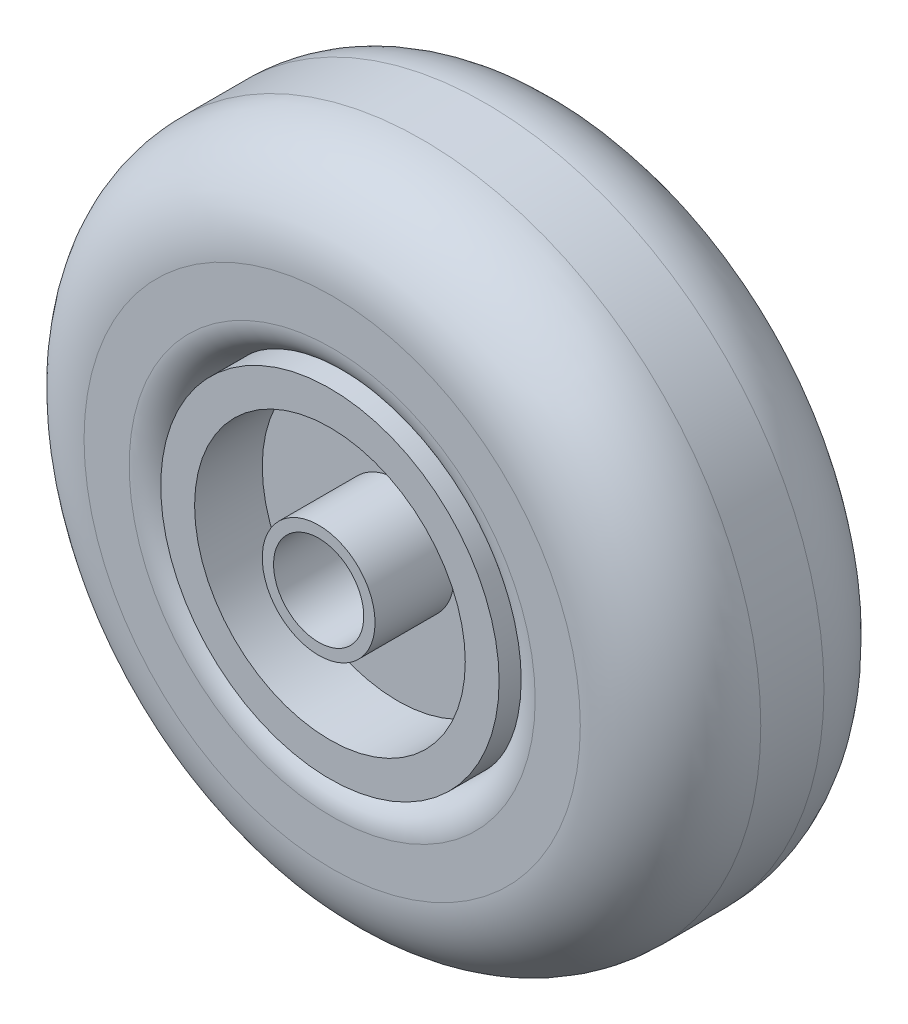
ISO-10303-21;
HEADER;
FILE_DESCRIPTION(('STEP AP214'),'2;1');
FILE_NAME('part.step','',(''),(''),'','','');
FILE_SCHEMA(('AUTOMOTIVE_DESIGN { 1 0 10303 214 1 1 1 1 }'));
ENDSEC;
DATA;
#1=APPLICATION_CONTEXT('core data for automotive mechanical design processes');
#2=APPLICATION_PROTOCOL_DEFINITION('international standard','automotive_design',2000,#1);
#3=PRODUCT_CONTEXT('',#1,'mechanical');
#4=PRODUCT('Part','Part','',(#3));
#5=PRODUCT_RELATED_PRODUCT_CATEGORY('part','',(#4));
#6=PRODUCT_DEFINITION_FORMATION('','',#4);
#7=PRODUCT_DEFINITION_CONTEXT('part definition',#1,'design');
#8=PRODUCT_DEFINITION('design','',#6,#7);
#9=PRODUCT_DEFINITION_SHAPE('','',#8);
#10=(LENGTH_UNIT() NAMED_UNIT(*) SI_UNIT(.MILLI.,.METRE.));
#11=(NAMED_UNIT(*) PLANE_ANGLE_UNIT() SI_UNIT($,.RADIAN.));
#12=(NAMED_UNIT(*) SI_UNIT($,.STERADIAN.) SOLID_ANGLE_UNIT());
#13=UNCERTAINTY_MEASURE_WITH_UNIT(LENGTH_MEASURE(1.E-05),#10,'distance_accuracy_value','');
#14=(GEOMETRIC_REPRESENTATION_CONTEXT(3) GLOBAL_UNCERTAINTY_ASSIGNED_CONTEXT((#13)) GLOBAL_UNIT_ASSIGNED_CONTEXT((#10,
#11,#12)) REPRESENTATION_CONTEXT('',''));
#15=CARTESIAN_POINT('',(0.,0.,0.));
#16=DIRECTION('',(0.,0.,1.));
#17=DIRECTION('',(1.,0.,0.));
#18=AXIS2_PLACEMENT_3D('',#15,#16,#17);
#19=CARTESIAN_POINT('',(0.,0.,17.4625));
#20=DIRECTION('',(0.,0.,1.));
#21=DIRECTION('',(1.,0.,0.));
#22=AXIS2_PLACEMENT_3D('',#19,#20,#21);
#23=PLANE('',#22);
#24=CARTESIAN_POINT('',(0.,0.,17.4625));
#25=DIRECTION('',(0.,0.,1.));
#26=DIRECTION('',(1.,0.,0.));
#27=AXIS2_PLACEMENT_3D('',#24,#25,#26);
#28=CIRCLE('',#27,23.8125);
#29=CARTESIAN_POINT('',(23.8125,0.,17.4625));
#30=VERTEX_POINT('',#29);
#31=EDGE_CURVE('E11',#30,#30,#28,.T.);
#32=ORIENTED_EDGE('',*,*,#31,.T.);
#33=EDGE_LOOP('',(#32));
#34=FACE_BOUND('',#33,.T.);
#35=CARTESIAN_POINT('',(0.,0.,17.4625));
#36=DIRECTION('',(0.,0.,-1.));
#37=DIRECTION('',(-1.,0.,0.));
#38=AXIS2_PLACEMENT_3D('',#35,#36,#37);
#39=CIRCLE('',#38,19.05);
#40=CARTESIAN_POINT('',(19.05,0.,17.4625));
#41=VERTEX_POINT('',#40);
#42=EDGE_CURVE('E70',#41,#41,#39,.T.);
#43=ORIENTED_EDGE('',*,*,#42,.T.);
#44=EDGE_LOOP('',(#43));
#45=FACE_BOUND('',#44,.T.);
#46=ADVANCED_FACE('F46',(#34,#45),#23,.T.);
#47=CARTESIAN_POINT('',(0.,0.,-17.4625));
#48=DIRECTION('',(0.,0.,1.));
#49=DIRECTION('',(1.,0.,0.));
#50=AXIS2_PLACEMENT_3D('',#47,#48,#49);
#51=PLANE('',#50);
#52=CARTESIAN_POINT('',(0.,0.,-17.4625));
#53=DIRECTION('',(0.,0.,-1.));
#54=DIRECTION('',(-1.,0.,0.));
#55=AXIS2_PLACEMENT_3D('',#52,#53,#54);
#56=CIRCLE('',#55,19.05);
#57=CARTESIAN_POINT('',(-19.05,0.,-17.4625));
#58=VERTEX_POINT('',#57);
#59=EDGE_CURVE('E61',#58,#58,#56,.T.);
#60=ORIENTED_EDGE('',*,*,#59,.F.);
#61=EDGE_LOOP('',(#60));
#62=FACE_BOUND('',#61,.T.);
#63=CARTESIAN_POINT('',(0.,0.,-17.4625));
#64=DIRECTION('',(0.,0.,1.));
#65=DIRECTION('',(1.,0.,0.));
#66=AXIS2_PLACEMENT_3D('',#63,#64,#65);
#67=CIRCLE('',#66,23.8125);
#68=CARTESIAN_POINT('',(23.8125,0.,-17.4625));
#69=VERTEX_POINT('',#68);
#70=EDGE_CURVE('E53',#69,#69,#67,.T.);
#71=ORIENTED_EDGE('',*,*,#70,.F.);
#72=EDGE_LOOP('',(#71));
#73=FACE_BOUND('',#72,.T.);
#74=ADVANCED_FACE('F48',(#62,#73),#51,.F.);
#75=CARTESIAN_POINT('',(0.,0.,0.));
#76=DIRECTION('',(0.,0.,1.));
#77=DIRECTION('',(1.,0.,0.));
#78=AXIS2_PLACEMENT_3D('',#75,#76,#77);
#79=CYLINDRICAL_SURFACE('',#78,23.8125);
#80=ORIENTED_EDGE('',*,*,#70,.T.);
#81=EDGE_LOOP('',(#80));
#82=FACE_BOUND('',#81,.T.);
#83=ORIENTED_EDGE('',*,*,#31,.F.);
#84=EDGE_LOOP('',(#83));
#85=FACE_BOUND('',#84,.T.);
#86=ADVANCED_FACE('F121',(#82,#85),#79,.T.);
#87=CARTESIAN_POINT('',(0.,0.,-7.9375));
#88=DIRECTION('',(0.,0.,-1.));
#89=DIRECTION('',(-1.,0.,0.));
#90=AXIS2_PLACEMENT_3D('',#87,#88,#89);
#91=CYLINDRICAL_SURFACE('',#90,19.05);
#92=CARTESIAN_POINT('',(0.,0.,-7.9375));
#93=DIRECTION('',(0.,0.,-1.));
#94=DIRECTION('',(-1.,0.,0.));
#95=AXIS2_PLACEMENT_3D('',#92,#93,#94);
#96=CIRCLE('',#95,19.05);
#97=CARTESIAN_POINT('',(-19.05,0.,-7.9375));
#98=VERTEX_POINT('',#97);
#99=EDGE_CURVE('E57',#98,#98,#96,.T.);
#100=CARTESIAN_POINT('',(-19.05,0.,-7.9375));
#101=CARTESIAN_POINT('',(-19.05,0.,-8.03671875));
#102=CARTESIAN_POINT('',(-19.05,0.,-8.1359375));
#103=CARTESIAN_POINT('',(-19.05,0.,-8.334375));
#104=CARTESIAN_POINT('',(-19.05,0.,-8.43359375));
#105=CARTESIAN_POINT('',(-19.05,0.,-8.63203125));
#106=CARTESIAN_POINT('',(-19.05,0.,-8.73125));
#107=CARTESIAN_POINT('',(-19.05,0.,-8.9296875));
#108=CARTESIAN_POINT('',(-19.05,0.,-9.02890625));
#109=CARTESIAN_POINT('',(-19.05,0.,-9.22734375));
#110=CARTESIAN_POINT('',(-19.05,0.,-9.3265625));
#111=CARTESIAN_POINT('',(-19.05,0.,-9.525));
#112=CARTESIAN_POINT('',(-19.05,0.,-9.62421875));
#113=CARTESIAN_POINT('',(-19.05,0.,-9.82265625));
#114=CARTESIAN_POINT('',(-19.05,0.,-9.921875));
#115=CARTESIAN_POINT('',(-19.05,0.,-10.1203125));
#116=CARTESIAN_POINT('',(-19.05,0.,-10.21953125));
#117=CARTESIAN_POINT('',(-19.05,0.,-10.41796875));
#118=CARTESIAN_POINT('',(-19.05,0.,-10.5171875));
#119=CARTESIAN_POINT('',(-19.05,0.,-10.715625));
#120=CARTESIAN_POINT('',(-19.05,0.,-10.81484375));
#121=CARTESIAN_POINT('',(-19.05,0.,-11.01328125));
#122=CARTESIAN_POINT('',(-19.05,0.,-11.1125));
#123=CARTESIAN_POINT('',(-19.05,0.,-11.3109375));
#124=CARTESIAN_POINT('',(-19.05,0.,-11.41015625));
#125=CARTESIAN_POINT('',(-19.05,0.,-11.60859375));
#126=CARTESIAN_POINT('',(-19.05,0.,-11.7078125));
#127=CARTESIAN_POINT('',(-19.05,0.,-11.90625));
#128=CARTESIAN_POINT('',(-19.05,0.,-12.00546875));
#129=CARTESIAN_POINT('',(-19.05,0.,-12.20390625));
#130=CARTESIAN_POINT('',(-19.05,0.,-12.303125));
#131=CARTESIAN_POINT('',(-19.05,0.,-12.5015625));
#132=CARTESIAN_POINT('',(-19.05,0.,-12.60078125));
#133=CARTESIAN_POINT('',(-19.05,0.,-12.79921875));
#134=CARTESIAN_POINT('',(-19.05,0.,-12.8984375));
#135=CARTESIAN_POINT('',(-19.05,0.,-13.096875));
#136=CARTESIAN_POINT('',(-19.05,0.,-13.19609375));
#137=CARTESIAN_POINT('',(-19.05,0.,-13.39453125));
#138=CARTESIAN_POINT('',(-19.05,0.,-13.49375));
#139=CARTESIAN_POINT('',(-19.05,0.,-13.6921875));
#140=CARTESIAN_POINT('',(-19.05,0.,-13.79140625));
#141=CARTESIAN_POINT('',(-19.05,0.,-13.98984375));
#142=CARTESIAN_POINT('',(-19.05,0.,-14.0890625));
#143=CARTESIAN_POINT('',(-19.05,0.,-14.2875));
#144=CARTESIAN_POINT('',(-19.05,0.,-14.38671875));
#145=CARTESIAN_POINT('',(-19.05,0.,-14.58515625));
#146=CARTESIAN_POINT('',(-19.05,0.,-14.684375));
#147=CARTESIAN_POINT('',(-19.05,0.,-14.8828125));
#148=CARTESIAN_POINT('',(-19.05,0.,-14.98203125));
#149=CARTESIAN_POINT('',(-19.05,0.,-15.18046875));
#150=CARTESIAN_POINT('',(-19.05,0.,-15.2796875));
#151=CARTESIAN_POINT('',(-19.05,0.,-15.478125));
#152=CARTESIAN_POINT('',(-19.05,0.,-15.57734375));
#153=CARTESIAN_POINT('',(-19.05,0.,-15.77578125));
#154=CARTESIAN_POINT('',(-19.05,0.,-15.875));
#155=CARTESIAN_POINT('',(-19.05,0.,-16.0734375));
#156=CARTESIAN_POINT('',(-19.05,0.,-16.17265625));
#157=CARTESIAN_POINT('',(-19.05,0.,-16.37109375));
#158=CARTESIAN_POINT('',(-19.05,0.,-16.4703125));
#159=CARTESIAN_POINT('',(-19.05,0.,-16.66875));
#160=CARTESIAN_POINT('',(-19.05,0.,-16.76796875));
#161=CARTESIAN_POINT('',(-19.05,0.,-16.96640625));
#162=CARTESIAN_POINT('',(-19.05,0.,-17.065625));
#163=CARTESIAN_POINT('',(-19.05,0.,-17.2640625));
#164=CARTESIAN_POINT('',(-19.05,0.,-17.36328125));
#165=CARTESIAN_POINT('',(-19.05,0.,-17.4625));
#166=B_SPLINE_CURVE_WITH_KNOTS('',3,(#100,#101,#102,#103,#104,#105,#106,#107,#108,#109,#110,
#111,#112,#113,#114,#115,#116,#117,#118,#119,#120,#121,#122,#123,#124,#125,#126,#127,#128,#129,
#130,#131,#132,#133,#134,#135,#136,#137,#138,#139,#140,#141,#142,#143,#144,#145,#146,#147,#148,
#149,#150,#151,#152,#153,#154,#155,#156,#157,#158,#159,#160,#161,#162,#163,#164,#165),
.UNSPECIFIED.,.F.,.F.,(4,2,2,2,2,2,2,2,2,2,2,2,2,2,2,2,2,2,2,2,2,2,2,2,2,2,2,2,2,2,2,2,4),(0.,
0.29765625,0.5953125,0.892968750000001,1.190625,1.48828125,1.7859375,2.08359375,2.38125,
2.67890625,2.9765625,3.27421875,3.571875,3.86953125,4.1671875,4.46484375,4.7625,5.06015625,
5.3578125,5.65546875,5.953125,6.25078125,6.5484375,6.84609375,7.14375,7.44140625,7.7390625,
8.03671875,8.334375,8.63203125,8.9296875,9.22734375,9.525),.UNSPECIFIED.);
#167=EDGE_CURVE('BSEAM113',#98,#58,#166,.T.);
#168=ORIENTED_EDGE('',*,*,#99,.F.);
#169=ORIENTED_EDGE('',*,*,#59,.T.);
#170=ORIENTED_EDGE('',*,*,#167,.T.);
#171=ORIENTED_EDGE('',*,*,#167,.F.);
#172=EDGE_LOOP('',(#168,#170,#169,#171));
#173=FACE_BOUND('',#172,.T.);
#174=ADVANCED_FACE('F113',(#173),#91,.F.);
#175=CARTESIAN_POINT('',(0.,0.,-7.9375));
#176=DIRECTION('',(0.,0.,-1.));
#177=DIRECTION('',(-1.,0.,0.));
#178=AXIS2_PLACEMENT_3D('',#175,#176,#177);
#179=PLANE('',#178);
#180=CARTESIAN_POINT('',(0.,0.,-7.9375));
#181=DIRECTION('',(0.,0.,-1.));
#182=DIRECTION('',(-1.,0.,0.));
#183=AXIS2_PLACEMENT_3D('',#180,#181,#182);
#184=CIRCLE('',#183,7.9375);
#185=CARTESIAN_POINT('',(-7.9375,0.,-7.9375));
#186=VERTEX_POINT('',#185);
#187=EDGE_CURVE('E65',#186,#186,#184,.T.);
#188=ORIENTED_EDGE('',*,*,#187,.F.);
#189=EDGE_LOOP('',(#188));
#190=FACE_BOUND('',#189,.T.);
#191=ORIENTED_EDGE('',*,*,#99,.T.);
#192=EDGE_LOOP('',(#191));
#193=FACE_BOUND('',#192,.T.);
#194=ADVANCED_FACE('F103',(#190,#193),#179,.T.);
#195=CARTESIAN_POINT('',(0.,0.,-7.9375));
#196=DIRECTION('',(0.,0.,-1.));
#197=DIRECTION('',(-1.,0.,0.));
#198=AXIS2_PLACEMENT_3D('',#195,#196,#197);
#199=CYLINDRICAL_SURFACE('',#198,7.9375);
#200=CARTESIAN_POINT('',(0.,0.,-19.05));
#201=DIRECTION('',(0.,0.,1.));
#202=DIRECTION('',(1.,0.,0.));
#203=AXIS2_PLACEMENT_3D('',#200,#201,#202);
#204=CIRCLE('',#203,7.9375);
#205=CARTESIAN_POINT('',(-7.9375,0.,-19.05));
#206=VERTEX_POINT('',#205);
#207=EDGE_CURVE('E79',#206,#206,#204,.T.);
#208=CARTESIAN_POINT('',(-7.9375,0.,-7.9375));
#209=CARTESIAN_POINT('',(-7.9375,0.,-8.05325520833333));
#210=CARTESIAN_POINT('',(-7.9375,0.,-8.16901041666666));
#211=CARTESIAN_POINT('',(-7.9375,0.,-8.40052083333333));
#212=CARTESIAN_POINT('',(-7.9375,0.,-8.51627604166666));
#213=CARTESIAN_POINT('',(-7.9375,0.,-8.74778645833333));
#214=CARTESIAN_POINT('',(-7.9375,0.,-8.86354166666666));
#215=CARTESIAN_POINT('',(-7.9375,0.,-9.09505208333333));
#216=CARTESIAN_POINT('',(-7.9375,0.,-9.21080729166667));
#217=CARTESIAN_POINT('',(-7.9375,0.,-9.44231770833333));
#218=CARTESIAN_POINT('',(-7.9375,0.,-9.55807291666667));
#219=CARTESIAN_POINT('',(-7.9375,0.,-9.78958333333333));
#220=CARTESIAN_POINT('',(-7.9375,0.,-9.90533854166666));
#221=CARTESIAN_POINT('',(-7.9375,0.,-10.1368489583333));
#222=CARTESIAN_POINT('',(-7.9375,0.,-10.2526041666667));
#223=CARTESIAN_POINT('',(-7.9375,0.,-10.4841145833333));
#224=CARTESIAN_POINT('',(-7.9375,0.,-10.5998697916667));
#225=CARTESIAN_POINT('',(-7.9375,0.,-10.8313802083333));
#226=CARTESIAN_POINT('',(-7.9375,0.,-10.9471354166667));
#227=CARTESIAN_POINT('',(-7.9375,0.,-11.1786458333333));
#228=CARTESIAN_POINT('',(-7.9375,0.,-11.2944010416667));
#229=CARTESIAN_POINT('',(-7.9375,0.,-11.5259114583333));
#230=CARTESIAN_POINT('',(-7.9375,0.,-11.6416666666667));
#231=CARTESIAN_POINT('',(-7.9375,0.,-11.8731770833333));
#232=CARTESIAN_POINT('',(-7.9375,0.,-11.9889322916667));
#233=CARTESIAN_POINT('',(-7.9375,0.,-12.2204427083333));
#234=CARTESIAN_POINT('',(-7.9375,0.,-12.3361979166667));
#235=CARTESIAN_POINT('',(-7.9375,0.,-12.5677083333333));
#236=CARTESIAN_POINT('',(-7.9375,0.,-12.6834635416667));
#237=CARTESIAN_POINT('',(-7.9375,0.,-12.9149739583333));
#238=CARTESIAN_POINT('',(-7.9375,0.,-13.0307291666667));
#239=CARTESIAN_POINT('',(-7.9375,0.,-13.2622395833333));
#240=CARTESIAN_POINT('',(-7.9375,0.,-13.3779947916667));
#241=CARTESIAN_POINT('',(-7.9375,0.,-13.6095052083333));
#242=CARTESIAN_POINT('',(-7.9375,0.,-13.7252604166667));
#243=CARTESIAN_POINT('',(-7.9375,0.,-13.9567708333333));
#244=CARTESIAN_POINT('',(-7.9375,0.,-14.0725260416667));
#245=CARTESIAN_POINT('',(-7.9375,0.,-14.3040364583333));
#246=CARTESIAN_POINT('',(-7.9375,0.,-14.4197916666667));
#247=CARTESIAN_POINT('',(-7.9375,0.,-14.6513020833333));
#248=CARTESIAN_POINT('',(-7.9375,0.,-14.7670572916667));
#249=CARTESIAN_POINT('',(-7.9375,0.,-14.9985677083333));
#250=CARTESIAN_POINT('',(-7.9375,0.,-15.1143229166667));
#251=CARTESIAN_POINT('',(-7.9375,0.,-15.3458333333333));
#252=CARTESIAN_POINT('',(-7.9375,0.,-15.4615885416667));
#253=CARTESIAN_POINT('',(-7.9375,0.,-15.6930989583333));
#254=CARTESIAN_POINT('',(-7.9375,0.,-15.8088541666667));
#255=CARTESIAN_POINT('',(-7.9375,0.,-16.0403645833333));
#256=CARTESIAN_POINT('',(-7.9375,0.,-16.1561197916667));
#257=CARTESIAN_POINT('',(-7.9375,0.,-16.3876302083333));
#258=CARTESIAN_POINT('',(-7.9375,0.,-16.5033854166667));
#259=CARTESIAN_POINT('',(-7.9375,0.,-16.7348958333333));
#260=CARTESIAN_POINT('',(-7.9375,0.,-16.8506510416667));
#261=CARTESIAN_POINT('',(-7.9375,0.,-17.0821614583333));
#262=CARTESIAN_POINT('',(-7.9375,0.,-17.1979166666667));
#263=CARTESIAN_POINT('',(-7.9375,0.,-17.4294270833333));
#264=CARTESIAN_POINT('',(-7.9375,0.,-17.5451822916667));
#265=CARTESIAN_POINT('',(-7.9375,0.,-17.7766927083333));
#266=CARTESIAN_POINT('',(-7.9375,0.,-17.8924479166667));
#267=CARTESIAN_POINT('',(-7.9375,0.,-18.1239583333333));
#268=CARTESIAN_POINT('',(-7.9375,0.,-18.2397135416667));
#269=CARTESIAN_POINT('',(-7.9375,0.,-18.4712239583333));
#270=CARTESIAN_POINT('',(-7.9375,0.,-18.5869791666667));
#271=CARTESIAN_POINT('',(-7.9375,0.,-18.8184895833333));
#272=CARTESIAN_POINT('',(-7.9375,0.,-18.9342447916667));
#273=CARTESIAN_POINT('',(-7.9375,0.,-19.05));
#274=B_SPLINE_CURVE_WITH_KNOTS('',3,(#208,#209,#210,#211,#212,#213,#214,#215,#216,#217,#218,
#219,#220,#221,#222,#223,#224,#225,#226,#227,#228,#229,#230,#231,#232,#233,#234,#235,#236,#237,
#238,#239,#240,#241,#242,#243,#244,#245,#246,#247,#248,#249,#250,#251,#252,#253,#254,#255,#256,
#257,#258,#259,#260,#261,#262,#263,#264,#265,#266,#267,#268,#269,#270,#271,#272,#273),
.UNSPECIFIED.,.F.,.F.,(4,2,2,2,2,2,2,2,2,2,2,2,2,2,2,2,2,2,2,2,2,2,2,2,2,2,2,2,2,2,2,2,4),(0.,
0.347265625000001,0.694531250000002,1.041796875,1.3890625,1.736328125,2.08359375,2.430859375,
2.778125,3.125390625,3.47265625,3.819921875,4.1671875,4.514453125,4.86171875,5.208984375,
5.55625,5.903515625,6.25078125,6.598046875,6.9453125,7.292578125,7.63984375,7.987109375,
8.334375,8.681640625,9.02890625,9.376171875,9.7234375,10.070703125,10.41796875,10.765234375,
11.1125),.UNSPECIFIED.);
#275=EDGE_CURVE('BSEAM100',#186,#206,#274,.T.);
#276=ORIENTED_EDGE('',*,*,#187,.T.);
#277=ORIENTED_EDGE('',*,*,#207,.T.);
#278=ORIENTED_EDGE('',*,*,#275,.T.);
#279=ORIENTED_EDGE('',*,*,#275,.F.);
#280=EDGE_LOOP('',(#276,#278,#277,#279));
#281=FACE_BOUND('',#280,.T.);
#282=ADVANCED_FACE('F100',(#281),#199,.T.);
#283=CARTESIAN_POINT('',(0.,0.,7.9375));
#284=DIRECTION('',(0.,0.,1.));
#285=DIRECTION('',(-1.,0.,0.));
#286=AXIS2_PLACEMENT_3D('',#283,#284,#285);
#287=PLANE('',#286);
#288=CARTESIAN_POINT('',(0.,0.,7.9375));
#289=DIRECTION('',(0.,0.,-1.));
#290=DIRECTION('',(-1.,0.,0.));
#291=AXIS2_PLACEMENT_3D('',#288,#289,#290);
#292=CIRCLE('',#291,19.05);
#293=CARTESIAN_POINT('',(19.05,0.,7.9375));
#294=VERTEX_POINT('',#293);
#295=EDGE_CURVE('E69',#294,#294,#292,.T.);
#296=ORIENTED_EDGE('',*,*,#295,.F.);
#297=EDGE_LOOP('',(#296));
#298=FACE_BOUND('',#297,.T.);
#299=CARTESIAN_POINT('',(0.,0.,7.9375));
#300=DIRECTION('',(0.,0.,-1.));
#301=DIRECTION('',(-1.,0.,0.));
#302=AXIS2_PLACEMENT_3D('',#299,#300,#301);
#303=CIRCLE('',#302,7.9375);
#304=CARTESIAN_POINT('',(7.9375,0.,7.9375));
#305=VERTEX_POINT('',#304);
#306=EDGE_CURVE('E73',#305,#305,#303,.T.);
#307=ORIENTED_EDGE('',*,*,#306,.T.);
#308=EDGE_LOOP('',(#307));
#309=FACE_BOUND('',#308,.T.);
#310=ADVANCED_FACE('F102',(#298,#309),#287,.T.);
#311=CARTESIAN_POINT('',(0.,0.,7.9375));
#312=DIRECTION('',(0.,0.,1.));
#313=DIRECTION('',(1.,0.,0.));
#314=AXIS2_PLACEMENT_3D('',#311,#312,#313);
#315=CYLINDRICAL_SURFACE('',#314,19.05);
#316=CARTESIAN_POINT('',(19.05,0.,7.9375));
#317=CARTESIAN_POINT('',(19.05,0.,8.03671875));
#318=CARTESIAN_POINT('',(19.05,0.,8.1359375));
#319=CARTESIAN_POINT('',(19.05,0.,8.334375));
#320=CARTESIAN_POINT('',(19.05,0.,8.43359375));
#321=CARTESIAN_POINT('',(19.05,0.,8.63203125));
#322=CARTESIAN_POINT('',(19.05,0.,8.73125));
#323=CARTESIAN_POINT('',(19.05,0.,8.9296875));
#324=CARTESIAN_POINT('',(19.05,0.,9.02890625));
#325=CARTESIAN_POINT('',(19.05,0.,9.22734375));
#326=CARTESIAN_POINT('',(19.05,0.,9.3265625));
#327=CARTESIAN_POINT('',(19.05,0.,9.525));
#328=CARTESIAN_POINT('',(19.05,0.,9.62421875));
#329=CARTESIAN_POINT('',(19.05,0.,9.82265625));
#330=CARTESIAN_POINT('',(19.05,0.,9.921875));
#331=CARTESIAN_POINT('',(19.05,0.,10.1203125));
#332=CARTESIAN_POINT('',(19.05,0.,10.21953125));
#333=CARTESIAN_POINT('',(19.05,0.,10.41796875));
#334=CARTESIAN_POINT('',(19.05,0.,10.5171875));
#335=CARTESIAN_POINT('',(19.05,0.,10.715625));
#336=CARTESIAN_POINT('',(19.05,0.,10.81484375));
#337=CARTESIAN_POINT('',(19.05,0.,11.01328125));
#338=CARTESIAN_POINT('',(19.05,0.,11.1125));
#339=CARTESIAN_POINT('',(19.05,0.,11.3109375));
#340=CARTESIAN_POINT('',(19.05,0.,11.41015625));
#341=CARTESIAN_POINT('',(19.05,0.,11.60859375));
#342=CARTESIAN_POINT('',(19.05,0.,11.7078125));
#343=CARTESIAN_POINT('',(19.05,0.,11.90625));
#344=CARTESIAN_POINT('',(19.05,0.,12.00546875));
#345=CARTESIAN_POINT('',(19.05,0.,12.20390625));
#346=CARTESIAN_POINT('',(19.05,0.,12.303125));
#347=CARTESIAN_POINT('',(19.05,0.,12.5015625));
#348=CARTESIAN_POINT('',(19.05,0.,12.60078125));
#349=CARTESIAN_POINT('',(19.05,0.,12.79921875));
#350=CARTESIAN_POINT('',(19.05,0.,12.8984375));
#351=CARTESIAN_POINT('',(19.05,0.,13.096875));
#352=CARTESIAN_POINT('',(19.05,0.,13.19609375));
#353=CARTESIAN_POINT('',(19.05,0.,13.39453125));
#354=CARTESIAN_POINT('',(19.05,0.,13.49375));
#355=CARTESIAN_POINT('',(19.05,0.,13.6921875));
#356=CARTESIAN_POINT('',(19.05,0.,13.79140625));
#357=CARTESIAN_POINT('',(19.05,0.,13.98984375));
#358=CARTESIAN_POINT('',(19.05,0.,14.0890625));
#359=CARTESIAN_POINT('',(19.05,0.,14.2875));
#360=CARTESIAN_POINT('',(19.05,0.,14.38671875));
#361=CARTESIAN_POINT('',(19.05,0.,14.58515625));
#362=CARTESIAN_POINT('',(19.05,0.,14.684375));
#363=CARTESIAN_POINT('',(19.05,0.,14.8828125));
#364=CARTESIAN_POINT('',(19.05,0.,14.98203125));
#365=CARTESIAN_POINT('',(19.05,0.,15.18046875));
#366=CARTESIAN_POINT('',(19.05,0.,15.2796875));
#367=CARTESIAN_POINT('',(19.05,0.,15.478125));
#368=CARTESIAN_POINT('',(19.05,0.,15.57734375));
#369=CARTESIAN_POINT('',(19.05,0.,15.77578125));
#370=CARTESIAN_POINT('',(19.05,0.,15.875));
#371=CARTESIAN_POINT('',(19.05,0.,16.0734375));
#372=CARTESIAN_POINT('',(19.05,0.,16.17265625));
#373=CARTESIAN_POINT('',(19.05,0.,16.37109375));
#374=CARTESIAN_POINT('',(19.05,0.,16.4703125));
#375=CARTESIAN_POINT('',(19.05,0.,16.66875));
#376=CARTESIAN_POINT('',(19.05,0.,16.76796875));
#377=CARTESIAN_POINT('',(19.05,0.,16.96640625));
#378=CARTESIAN_POINT('',(19.05,0.,17.065625));
#379=CARTESIAN_POINT('',(19.05,0.,17.2640625));
#380=CARTESIAN_POINT('',(19.05,0.,17.36328125));
#381=CARTESIAN_POINT('',(19.05,0.,17.4625));
#382=B_SPLINE_CURVE_WITH_KNOTS('',3,(#316,#317,#318,#319,#320,#321,#322,#323,#324,#325,#326,
#327,#328,#329,#330,#331,#332,#333,#334,#335,#336,#337,#338,#339,#340,#341,#342,#343,#344,#345,
#346,#347,#348,#349,#350,#351,#352,#353,#354,#355,#356,#357,#358,#359,#360,#361,#362,#363,#364,
#365,#366,#367,#368,#369,#370,#371,#372,#373,#374,#375,#376,#377,#378,#379,#380,#381),
.UNSPECIFIED.,.F.,.F.,(4,2,2,2,2,2,2,2,2,2,2,2,2,2,2,2,2,2,2,2,2,2,2,2,2,2,2,2,2,2,2,2,4),(0.,
0.29765625,0.5953125,0.892968750000001,1.190625,1.48828125,1.7859375,2.08359375,2.38125,
2.67890625,2.9765625,3.27421875,3.571875,3.86953125,4.1671875,4.46484375,4.7625,5.06015625,
5.3578125,5.65546875,5.953125,6.25078125,6.5484375,6.84609375,7.14375,7.44140625,
7.73906250000001,8.03671875,8.334375,8.63203125,8.9296875,9.22734375,9.525),.UNSPECIFIED.);
#383=EDGE_CURVE('BSEAM110',#294,#41,#382,.T.);
#384=ORIENTED_EDGE('',*,*,#295,.T.);
#385=ORIENTED_EDGE('',*,*,#42,.F.);
#386=ORIENTED_EDGE('',*,*,#383,.T.);
#387=ORIENTED_EDGE('',*,*,#383,.F.);
#388=EDGE_LOOP('',(#384,#386,#385,#387));
#389=FACE_BOUND('',#388,.T.);
#390=ADVANCED_FACE('F110',(#389),#315,.F.);
#391=CARTESIAN_POINT('',(0.,0.,7.9375));
#392=DIRECTION('',(0.,0.,1.));
#393=DIRECTION('',(1.,0.,0.));
#394=AXIS2_PLACEMENT_3D('',#391,#392,#393);
#395=CYLINDRICAL_SURFACE('',#394,7.9375);
#396=CARTESIAN_POINT('',(0.,0.,19.05));
#397=DIRECTION('',(0.,0.,1.));
#398=DIRECTION('',(1.,0.,0.));
#399=AXIS2_PLACEMENT_3D('',#396,#397,#398);
#400=CIRCLE('',#399,7.9375);
#401=CARTESIAN_POINT('',(7.9375,0.,19.05));
#402=VERTEX_POINT('',#401);
#403=EDGE_CURVE('E78',#402,#402,#400,.T.);
#404=CARTESIAN_POINT('',(7.9375,0.,7.9375));
#405=CARTESIAN_POINT('',(7.9375,0.,8.05325520833333));
#406=CARTESIAN_POINT('',(7.9375,0.,8.16901041666667));
#407=CARTESIAN_POINT('',(7.9375,0.,8.40052083333333));
#408=CARTESIAN_POINT('',(7.9375,0.,8.51627604166667));
#409=CARTESIAN_POINT('',(7.9375,0.,8.74778645833333));
#410=CARTESIAN_POINT('',(7.9375,0.,8.86354166666666));
#411=CARTESIAN_POINT('',(7.9375,0.,9.09505208333333));
#412=CARTESIAN_POINT('',(7.9375,0.,9.21080729166667));
#413=CARTESIAN_POINT('',(7.9375,0.,9.44231770833333));
#414=CARTESIAN_POINT('',(7.9375,0.,9.55807291666667));
#415=CARTESIAN_POINT('',(7.9375,0.,9.78958333333333));
#416=CARTESIAN_POINT('',(7.9375,0.,9.90533854166667));
#417=CARTESIAN_POINT('',(7.9375,0.,10.1368489583333));
#418=CARTESIAN_POINT('',(7.9375,0.,10.2526041666667));
#419=CARTESIAN_POINT('',(7.9375,0.,10.4841145833333));
#420=CARTESIAN_POINT('',(7.9375,0.,10.5998697916667));
#421=CARTESIAN_POINT('',(7.9375,0.,10.8313802083333));
#422=CARTESIAN_POINT('',(7.9375,0.,10.9471354166667));
#423=CARTESIAN_POINT('',(7.9375,0.,11.1786458333333));
#424=CARTESIAN_POINT('',(7.9375,0.,11.2944010416667));
#425=CARTESIAN_POINT('',(7.9375,0.,11.5259114583333));
#426=CARTESIAN_POINT('',(7.9375,0.,11.6416666666667));
#427=CARTESIAN_POINT('',(7.9375,0.,11.8731770833333));
#428=CARTESIAN_POINT('',(7.9375,0.,11.9889322916667));
#429=CARTESIAN_POINT('',(7.9375,0.,12.2204427083333));
#430=CARTESIAN_POINT('',(7.9375,0.,12.3361979166667));
#431=CARTESIAN_POINT('',(7.9375,0.,12.5677083333333));
#432=CARTESIAN_POINT('',(7.9375,0.,12.6834635416667));
#433=CARTESIAN_POINT('',(7.9375,0.,12.9149739583333));
#434=CARTESIAN_POINT('',(7.9375,0.,13.0307291666667));
#435=CARTESIAN_POINT('',(7.9375,0.,13.2622395833333));
#436=CARTESIAN_POINT('',(7.9375,0.,13.3779947916667));
#437=CARTESIAN_POINT('',(7.9375,0.,13.6095052083333));
#438=CARTESIAN_POINT('',(7.9375,0.,13.7252604166667));
#439=CARTESIAN_POINT('',(7.9375,0.,13.9567708333333));
#440=CARTESIAN_POINT('',(7.9375,0.,14.0725260416667));
#441=CARTESIAN_POINT('',(7.9375,0.,14.3040364583333));
#442=CARTESIAN_POINT('',(7.9375,0.,14.4197916666667));
#443=CARTESIAN_POINT('',(7.9375,0.,14.6513020833333));
#444=CARTESIAN_POINT('',(7.9375,0.,14.7670572916667));
#445=CARTESIAN_POINT('',(7.9375,0.,14.9985677083333));
#446=CARTESIAN_POINT('',(7.9375,0.,15.1143229166667));
#447=CARTESIAN_POINT('',(7.9375,0.,15.3458333333333));
#448=CARTESIAN_POINT('',(7.9375,0.,15.4615885416667));
#449=CARTESIAN_POINT('',(7.9375,0.,15.6930989583333));
#450=CARTESIAN_POINT('',(7.9375,0.,15.8088541666667));
#451=CARTESIAN_POINT('',(7.9375,0.,16.0403645833333));
#452=CARTESIAN_POINT('',(7.9375,0.,16.1561197916667));
#453=CARTESIAN_POINT('',(7.9375,0.,16.3876302083333));
#454=CARTESIAN_POINT('',(7.9375,0.,16.5033854166667));
#455=CARTESIAN_POINT('',(7.9375,0.,16.7348958333333));
#456=CARTESIAN_POINT('',(7.9375,0.,16.8506510416667));
#457=CARTESIAN_POINT('',(7.9375,0.,17.0821614583333));
#458=CARTESIAN_POINT('',(7.9375,0.,17.1979166666667));
#459=CARTESIAN_POINT('',(7.9375,0.,17.4294270833333));
#460=CARTESIAN_POINT('',(7.9375,0.,17.5451822916667));
#461=CARTESIAN_POINT('',(7.9375,0.,17.7766927083333));
#462=CARTESIAN_POINT('',(7.9375,0.,17.8924479166667));
#463=CARTESIAN_POINT('',(7.9375,0.,18.1239583333333));
#464=CARTESIAN_POINT('',(7.9375,0.,18.2397135416667));
#465=CARTESIAN_POINT('',(7.9375,0.,18.4712239583333));
#466=CARTESIAN_POINT('',(7.9375,0.,18.5869791666667));
#467=CARTESIAN_POINT('',(7.9375,0.,18.8184895833333));
#468=CARTESIAN_POINT('',(7.9375,0.,18.9342447916667));
#469=CARTESIAN_POINT('',(7.9375,0.,19.05));
#470=B_SPLINE_CURVE_WITH_KNOTS('',3,(#404,#405,#406,#407,#408,#409,#410,#411,#412,#413,#414,
#415,#416,#417,#418,#419,#420,#421,#422,#423,#424,#425,#426,#427,#428,#429,#430,#431,#432,#433,
#434,#435,#436,#437,#438,#439,#440,#441,#442,#443,#444,#445,#446,#447,#448,#449,#450,#451,#452,
#453,#454,#455,#456,#457,#458,#459,#460,#461,#462,#463,#464,#465,#466,#467,#468,#469),
.UNSPECIFIED.,.F.,.F.,(4,2,2,2,2,2,2,2,2,2,2,2,2,2,2,2,2,2,2,2,2,2,2,2,2,2,2,2,2,2,2,2,4),(0.,
0.347265625000001,0.694531250000002,1.041796875,1.3890625,1.736328125,2.08359375,2.430859375,
2.778125,3.125390625,3.47265625,3.819921875,4.1671875,4.514453125,4.86171875,5.208984375,
5.55625,5.903515625,6.25078125,6.598046875,6.9453125,7.292578125,7.63984375,7.987109375,
8.334375,8.681640625,9.02890625,9.376171875,9.7234375,10.070703125,10.41796875,10.765234375,
11.1125),.UNSPECIFIED.);
#471=EDGE_CURVE('BSEAM158',#305,#402,#470,.T.);
#472=ORIENTED_EDGE('',*,*,#306,.F.);
#473=ORIENTED_EDGE('',*,*,#403,.F.);
#474=ORIENTED_EDGE('',*,*,#471,.T.);
#475=ORIENTED_EDGE('',*,*,#471,.F.);
#476=EDGE_LOOP('',(#472,#474,#473,#475));
#477=FACE_BOUND('',#476,.T.);
#478=ADVANCED_FACE('F158',(#477),#395,.T.);
#479=CARTESIAN_POINT('',(0.,0.,19.05));
#480=DIRECTION('',(0.,0.,1.));
#481=DIRECTION('',(1.,0.,0.));
#482=AXIS2_PLACEMENT_3D('',#479,#480,#481);
#483=PLANE('',#482);
#484=CARTESIAN_POINT('',(0.,0.,19.05));
#485=DIRECTION('',(0.,0.,-1.));
#486=DIRECTION('',(-1.,0.,0.));
#487=AXIS2_PLACEMENT_3D('',#484,#485,#486);
#488=CIRCLE('',#487,6.35);
#489=CARTESIAN_POINT('',(-6.35,0.,19.05));
#490=VERTEX_POINT('',#489);
#491=EDGE_CURVE('E82',#490,#490,#488,.T.);
#492=ORIENTED_EDGE('',*,*,#491,.T.);
#493=EDGE_LOOP('',(#492));
#494=FACE_BOUND('',#493,.T.);
#495=ORIENTED_EDGE('',*,*,#403,.T.);
#496=EDGE_LOOP('',(#495));
#497=FACE_BOUND('',#496,.T.);
#498=ADVANCED_FACE('F96',(#494,#497),#483,.T.);
#499=CARTESIAN_POINT('',(0.,0.,-19.05));
#500=DIRECTION('',(0.,0.,1.));
#501=DIRECTION('',(1.,0.,0.));
#502=AXIS2_PLACEMENT_3D('',#499,#500,#501);
#503=PLANE('',#502);
#504=CARTESIAN_POINT('',(0.,0.,-19.05));
#505=DIRECTION('',(0.,0.,-1.));
#506=DIRECTION('',(-1.,0.,0.));
#507=AXIS2_PLACEMENT_3D('',#504,#505,#506);
#508=CIRCLE('',#507,6.35);
#509=CARTESIAN_POINT('',(-6.35,0.,-19.05));
#510=VERTEX_POINT('',#509);
#511=EDGE_CURVE('E87',#510,#510,#508,.T.);
#512=ORIENTED_EDGE('',*,*,#511,.F.);
#513=EDGE_LOOP('',(#512));
#514=FACE_BOUND('',#513,.T.);
#515=ORIENTED_EDGE('',*,*,#207,.F.);
#516=EDGE_LOOP('',(#515));
#517=FACE_BOUND('',#516,.T.);
#518=ADVANCED_FACE('F93',(#514,#517),#503,.F.);
#519=CARTESIAN_POINT('',(0.,0.,19.05));
#520=DIRECTION('',(0.,0.,-1.));
#521=DIRECTION('',(-1.,0.,0.));
#522=AXIS2_PLACEMENT_3D('',#519,#520,#521);
#523=CYLINDRICAL_SURFACE('',#522,6.35);
#524=ORIENTED_EDGE('',*,*,#491,.F.);
#525=EDGE_LOOP('',(#524));
#526=FACE_BOUND('',#525,.T.);
#527=ORIENTED_EDGE('',*,*,#511,.T.);
#528=EDGE_LOOP('',(#527));
#529=FACE_BOUND('',#528,.T.);
#530=ADVANCED_FACE('F91',(#526,#529),#523,.F.);
#531=CLOSED_SHELL('',(#46,#74,#86,#174,#194,#282,#310,#390,#478,#498,#518,#530));
#532=MANIFOLD_SOLID_BREP('B2',#531);
#533=CARTESIAN_POINT('',(0.,0.,17.145));
#534=DIRECTION('',(0.,0.,1.));
#535=DIRECTION('',(1.,0.,0.));
#536=AXIS2_PLACEMENT_3D('',#533,#534,#535);
#537=PLANE('',#536);
#538=CARTESIAN_POINT('',(0.,0.,17.145));
#539=DIRECTION('',(0.,0.,1.));
#540=DIRECTION('',(1.,0.,0.));
#541=AXIS2_PLACEMENT_3D('',#538,#539,#540);
#542=CIRCLE('',#541,28.575);
#543=CARTESIAN_POINT('',(28.575,0.,17.145));
#544=VERTEX_POINT('',#543);
#545=EDGE_CURVE('E45',#544,#544,#542,.F.);
#546=ORIENTED_EDGE('',*,*,#545,.T.);
#547=EDGE_LOOP('',(#546));
#548=FACE_BOUND('',#547,.T.);
#549=CARTESIAN_POINT('',(0.,0.,17.145));
#550=DIRECTION('',(0.,0.,1.));
#551=DIRECTION('',(1.,0.,0.));
#552=AXIS2_PLACEMENT_3D('',#549,#550,#551);
#553=CIRCLE('',#552,34.925);
#554=CARTESIAN_POINT('',(34.925,0.,17.145));
#555=VERTEX_POINT('',#554);
#556=EDGE_CURVE('E289',#555,#555,#553,.T.);
#557=ORIENTED_EDGE('',*,*,#556,.T.);
#558=EDGE_LOOP('',(#557));
#559=FACE_BOUND('',#558,.T.);
#560=ADVANCED_FACE('F269',(#548,#559),#537,.T.);
#561=CARTESIAN_POINT('',(0.,0.,-17.145));
#562=DIRECTION('',(0.,0.,1.));
#563=DIRECTION('',(1.,0.,0.));
#564=AXIS2_PLACEMENT_3D('',#561,#562,#563);
#565=PLANE('',#564);
#566=CARTESIAN_POINT('',(0.,0.,-17.145));
#567=DIRECTION('',(0.,0.,1.));
#568=DIRECTION('',(1.,0.,0.));
#569=AXIS2_PLACEMENT_3D('',#566,#567,#568);
#570=CIRCLE('',#569,28.575);
#571=CARTESIAN_POINT('',(28.575,0.,-17.145));
#572=VERTEX_POINT('',#571);
#573=EDGE_CURVE('E284',#572,#572,#570,.T.);
#574=ORIENTED_EDGE('',*,*,#573,.T.);
#575=EDGE_LOOP('',(#574));
#576=FACE_BOUND('',#575,.T.);
#577=CARTESIAN_POINT('',(0.,0.,-17.145));
#578=DIRECTION('',(0.,0.,1.));
#579=DIRECTION('',(1.,0.,0.));
#580=AXIS2_PLACEMENT_3D('',#577,#578,#579);
#581=CIRCLE('',#580,34.925);
#582=CARTESIAN_POINT('',(34.925,0.,-17.145));
#583=VERTEX_POINT('',#582);
#584=EDGE_CURVE('E292',#583,#583,#581,.F.);
#585=ORIENTED_EDGE('',*,*,#584,.T.);
#586=EDGE_LOOP('',(#585));
#587=FACE_BOUND('',#586,.T.);
#588=ADVANCED_FACE('F313',(#576,#587),#565,.F.);
#589=CARTESIAN_POINT('',(0.,0.,17.145));
#590=DIRECTION('',(0.,0.,-1.));
#591=DIRECTION('',(-1.,0.,0.));
#592=AXIS2_PLACEMENT_3D('',#589,#590,#591);
#593=CYLINDRICAL_SURFACE('',#592,47.625);
#594=CARTESIAN_POINT('',(0.,0.,-4.445));
#595=DIRECTION('',(0.,0.,1.));
#596=DIRECTION('',(1.,0.,0.));
#597=AXIS2_PLACEMENT_3D('',#594,#595,#596);
#598=CIRCLE('',#597,47.625);
#599=CARTESIAN_POINT('',(47.625,0.,-4.445));
#600=VERTEX_POINT('',#599);
#601=EDGE_CURVE('E295',#600,#600,#598,.T.);
#602=ORIENTED_EDGE('',*,*,#601,.T.);
#603=EDGE_LOOP('',(#602));
#604=FACE_BOUND('',#603,.T.);
#605=CARTESIAN_POINT('',(0.,0.,4.445));
#606=DIRECTION('',(0.,0.,1.));
#607=DIRECTION('',(1.,0.,0.));
#608=AXIS2_PLACEMENT_3D('',#605,#606,#607);
#609=CIRCLE('',#608,47.625);
#610=CARTESIAN_POINT('',(47.625,0.,4.445));
#611=VERTEX_POINT('',#610);
#612=EDGE_CURVE('E298',#611,#611,#609,.F.);
#613=ORIENTED_EDGE('',*,*,#612,.T.);
#614=EDGE_LOOP('',(#613));
#615=FACE_BOUND('',#614,.T.);
#616=ADVANCED_FACE('F302',(#604,#615),#593,.T.);
#617=CARTESIAN_POINT('',(0.,0.,17.145));
#618=DIRECTION('',(0.,0.,-1.));
#619=DIRECTION('',(-1.,0.,0.));
#620=AXIS2_PLACEMENT_3D('',#617,#618,#619);
#621=CYLINDRICAL_SURFACE('',#620,23.8125);
#622=CARTESIAN_POINT('',(0.,0.,-12.3825));
#623=DIRECTION('',(0.,0.,1.));
#624=DIRECTION('',(1.,0.,0.));
#625=AXIS2_PLACEMENT_3D('',#622,#623,#624);
#626=CIRCLE('',#625,23.8125);
#627=CARTESIAN_POINT('',(23.8125,0.,-12.3825));
#628=VERTEX_POINT('',#627);
#629=EDGE_CURVE('E276',#628,#628,#626,.F.);
#630=ORIENTED_EDGE('',*,*,#629,.T.);
#631=EDGE_LOOP('',(#630));
#632=FACE_BOUND('',#631,.T.);
#633=CARTESIAN_POINT('',(0.,0.,12.3825));
#634=DIRECTION('',(0.,0.,1.));
#635=DIRECTION('',(1.,0.,0.));
#636=AXIS2_PLACEMENT_3D('',#633,#634,#635);
#637=CIRCLE('',#636,23.8125);
#638=CARTESIAN_POINT('',(23.8125,0.,12.3825));
#639=VERTEX_POINT('',#638);
#640=EDGE_CURVE('E280',#639,#639,#637,.T.);
#641=ORIENTED_EDGE('',*,*,#640,.T.);
#642=EDGE_LOOP('',(#641));
#643=FACE_BOUND('',#642,.T.);
#644=ADVANCED_FACE('F321',(#632,#643),#621,.F.);
#645=CARTESIAN_POINT('',(0.,0.,-4.445));
#646=DIRECTION('',(0.,0.,1.));
#647=DIRECTION('',(1.,0.,0.));
#648=AXIS2_PLACEMENT_3D('',#645,#646,#647);
#649=TOROIDAL_SURFACE('',#648,34.925,12.7);
#650=ORIENTED_EDGE('',*,*,#584,.F.);
#651=EDGE_LOOP('',(#650));
#652=FACE_BOUND('',#651,.T.);
#653=ORIENTED_EDGE('',*,*,#601,.F.);
#654=EDGE_LOOP('',(#653));
#655=FACE_BOUND('',#654,.T.);
#656=ADVANCED_FACE('F308',(#652,#655),#649,.T.);
#657=CARTESIAN_POINT('',(0.,0.,4.445));
#658=DIRECTION('',(0.,0.,1.));
#659=DIRECTION('',(1.,0.,0.));
#660=AXIS2_PLACEMENT_3D('',#657,#658,#659);
#661=TOROIDAL_SURFACE('',#660,34.925,12.7);
#662=ORIENTED_EDGE('',*,*,#612,.F.);
#663=EDGE_LOOP('',(#662));
#664=FACE_BOUND('',#663,.T.);
#665=ORIENTED_EDGE('',*,*,#556,.F.);
#666=EDGE_LOOP('',(#665));
#667=FACE_BOUND('',#666,.T.);
#668=ADVANCED_FACE('F304',(#664,#667),#661,.T.);
#669=CARTESIAN_POINT('',(0.,0.,-12.3825));
#670=DIRECTION('',(0.,0.,1.));
#671=DIRECTION('',(1.,0.,0.));
#672=AXIS2_PLACEMENT_3D('',#669,#670,#671);
#673=TOROIDAL_SURFACE('',#672,28.575,4.7625);
#674=ORIENTED_EDGE('',*,*,#629,.F.);
#675=EDGE_LOOP('',(#674));
#676=FACE_BOUND('',#675,.T.);
#677=ORIENTED_EDGE('',*,*,#573,.F.);
#678=EDGE_LOOP('',(#677));
#679=FACE_BOUND('',#678,.T.);
#680=ADVANCED_FACE('F307',(#676,#679),#673,.T.);
#681=CARTESIAN_POINT('',(0.,0.,12.3825));
#682=DIRECTION('',(0.,0.,1.));
#683=DIRECTION('',(1.,0.,0.));
#684=AXIS2_PLACEMENT_3D('',#681,#682,#683);
#685=TOROIDAL_SURFACE('',#684,28.575,4.7625);
#686=ORIENTED_EDGE('',*,*,#545,.F.);
#687=EDGE_LOOP('',(#686));
#688=FACE_BOUND('',#687,.T.);
#689=ORIENTED_EDGE('',*,*,#640,.F.);
#690=EDGE_LOOP('',(#689));
#691=FACE_BOUND('',#690,.T.);
#692=ADVANCED_FACE('F271',(#688,#691),#685,.T.);
#693=CLOSED_SHELL('',(#560,#588,#616,#644,#656,#668,#680,#692));
#694=MANIFOLD_SOLID_BREP('B6',#693);
#695=ADVANCED_BREP_SHAPE_REPRESENTATION('',(#18,#532,#694),#14);
#696=SHAPE_DEFINITION_REPRESENTATION(#9,#695);
ENDSEC;
END-ISO-10303-21;
